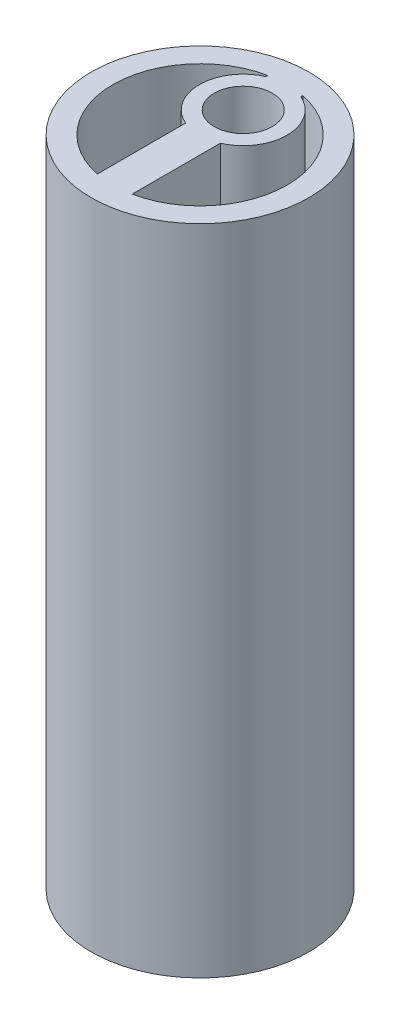
ISO-10303-21;
HEADER;
FILE_DESCRIPTION(('STEP AP214'),'2;1');
FILE_NAME('part.step','',(''),(''),'','','');
FILE_SCHEMA(('AUTOMOTIVE_DESIGN { 1 0 10303 214 1 1 1 1 }'));
ENDSEC;
DATA;
#1=APPLICATION_CONTEXT('core data for automotive mechanical design processes');
#2=APPLICATION_PROTOCOL_DEFINITION('international standard','automotive_design',2000,#1);
#3=PRODUCT_CONTEXT('',#1,'mechanical');
#4=PRODUCT('Part','Part','',(#3));
#5=PRODUCT_RELATED_PRODUCT_CATEGORY('part','',(#4));
#6=PRODUCT_DEFINITION_FORMATION('','',#4);
#7=PRODUCT_DEFINITION_CONTEXT('part definition',#1,'design');
#8=PRODUCT_DEFINITION('design','',#6,#7);
#9=PRODUCT_DEFINITION_SHAPE('','',#8);
#10=(LENGTH_UNIT() NAMED_UNIT(*) SI_UNIT(.MILLI.,.METRE.));
#11=(NAMED_UNIT(*) PLANE_ANGLE_UNIT() SI_UNIT($,.RADIAN.));
#12=(NAMED_UNIT(*) SI_UNIT($,.STERADIAN.) SOLID_ANGLE_UNIT());
#13=UNCERTAINTY_MEASURE_WITH_UNIT(LENGTH_MEASURE(1.E-05),#10,'distance_accuracy_value','');
#14=(GEOMETRIC_REPRESENTATION_CONTEXT(3) GLOBAL_UNCERTAINTY_ASSIGNED_CONTEXT((#13)) GLOBAL_UNIT_ASSIGNED_CONTEXT((#10,
#11,#12)) REPRESENTATION_CONTEXT('',''));
#15=CARTESIAN_POINT('',(0.,0.,0.));
#16=DIRECTION('',(0.,0.,1.));
#17=DIRECTION('',(1.,0.,0.));
#18=AXIS2_PLACEMENT_3D('',#15,#16,#17);
#19=CARTESIAN_POINT('',(-1.2,0.,-6.74946092621553));
#20=DIRECTION('',(-1.,0.,0.));
#21=DIRECTION('',(0.,0.,1.));
#22=AXIS2_PLACEMENT_3D('',#19,#20,#21);
#23=PLANE('',#22);
#24=DIRECTION('',(0.,1.,0.));
#25=VECTOR('',#24,1.);
#26=CARTESIAN_POINT('',(-1.2,0.,-0.203984650656139));
#27=LINE('',#26,#25);
#28=CARTESIAN_POINT('',(-1.2,0.,-0.203984650656139));
#29=VERTEX_POINT('',#28);
#30=CARTESIAN_POINT('',(-1.2,45.,-0.203984650656139));
#31=VERTEX_POINT('',#30);
#32=EDGE_CURVE('E185',#29,#31,#27,.T.);
#33=ORIENTED_EDGE('',*,*,#32,.F.);
#34=DIRECTION('',(0.,0.,1.));
#35=VECTOR('',#34,1.);
#36=CARTESIAN_POINT('',(-1.2,0.,-6.74946092621553));
#37=LINE('',#36,#35);
#38=CARTESIAN_POINT('',(-1.2,0.,5.87877538267963));
#39=VERTEX_POINT('',#38);
#40=EDGE_CURVE('E126',#29,#39,#37,.T.);
#41=ORIENTED_EDGE('',*,*,#40,.T.);
#42=DIRECTION('',(0.,-1.,0.));
#43=VECTOR('',#42,1.);
#44=CARTESIAN_POINT('',(-1.2,45.,5.87877538267963));
#45=LINE('',#44,#43);
#46=CARTESIAN_POINT('',(-1.2,45.,5.87877538267963));
#47=VERTEX_POINT('',#46);
#48=EDGE_CURVE('E160',#39,#47,#45,.F.);
#49=ORIENTED_EDGE('',*,*,#48,.T.);
#50=DIRECTION('',(0.,0.,1.));
#51=VECTOR('',#50,1.);
#52=CARTESIAN_POINT('',(-1.2,45.,-6.74946092621553));
#53=LINE('',#52,#51);
#54=EDGE_CURVE('E195',#31,#47,#53,.T.);
#55=ORIENTED_EDGE('',*,*,#54,.F.);
#56=EDGE_LOOP('',(#33,#41,#49,#55));
#57=FACE_BOUND('',#56,.T.);
#58=ADVANCED_FACE('F39',(#57),#23,.T.);
#59=CARTESIAN_POINT('',(1.2,0.,-6.74946092621553));
#60=DIRECTION('',(1.,0.,0.));
#61=DIRECTION('',(0.,0.,-1.));
#62=AXIS2_PLACEMENT_3D('',#59,#60,#61);
#63=PLANE('',#62);
#64=DIRECTION('',(0.,1.,0.));
#65=VECTOR('',#64,1.);
#66=CARTESIAN_POINT('',(1.2,0.,-5.74586140251381));
#67=LINE('',#66,#65);
#68=CARTESIAN_POINT('',(1.2,0.,-5.74586140251381));
#69=VERTEX_POINT('',#68);
#70=CARTESIAN_POINT('',(1.2,45.,-5.74586140251381));
#71=VERTEX_POINT('',#70);
#72=EDGE_CURVE('E11',#69,#71,#67,.T.);
#73=ORIENTED_EDGE('',*,*,#72,.F.);
#74=DIRECTION('',(0.,0.,-1.));
#75=VECTOR('',#74,1.);
#76=CARTESIAN_POINT('',(1.2,0.,-6.74946092621553));
#77=LINE('',#76,#75);
#78=CARTESIAN_POINT('',(1.2,0.,-5.87877538267963));
#79=VERTEX_POINT('',#78);
#80=EDGE_CURVE('E182',#69,#79,#77,.T.);
#81=ORIENTED_EDGE('',*,*,#80,.T.);
#82=DIRECTION('',(0.,-1.,0.));
#83=VECTOR('',#82,1.);
#84=CARTESIAN_POINT('',(1.2,45.,-5.87877538267963));
#85=LINE('',#84,#83);
#86=CARTESIAN_POINT('',(1.2,45.,-5.87877538267963));
#87=VERTEX_POINT('',#86);
#88=EDGE_CURVE('E150',#79,#87,#85,.F.);
#89=ORIENTED_EDGE('',*,*,#88,.T.);
#90=DIRECTION('',(0.,0.,-1.));
#91=VECTOR('',#90,1.);
#92=CARTESIAN_POINT('',(1.2,45.,-6.74946092621553));
#93=LINE('',#92,#91);
#94=EDGE_CURVE('E127',#71,#87,#93,.T.);
#95=ORIENTED_EDGE('',*,*,#94,.F.);
#96=EDGE_LOOP('',(#73,#81,#89,#95));
#97=FACE_BOUND('',#96,.T.);
#98=ADVANCED_FACE('F228',(#97),#63,.T.);
#99=CARTESIAN_POINT('',(0.,45.,0.));
#100=DIRECTION('',(0.,-1.,0.));
#101=DIRECTION('',(0.,0.,-1.));
#102=AXIS2_PLACEMENT_3D('',#99,#100,#101);
#103=CYLINDRICAL_SURFACE('',#102,6.);
#104=DIRECTION('',(0.,-1.,0.));
#105=VECTOR('',#104,1.);
#106=CARTESIAN_POINT('',(-1.2,45.,-5.87877538267963));
#107=LINE('',#106,#105);
#108=CARTESIAN_POINT('',(-1.2,45.,-5.87877538267963));
#109=VERTEX_POINT('',#108);
#110=CARTESIAN_POINT('',(-1.2,0.,-5.87877538267963));
#111=VERTEX_POINT('',#110);
#112=EDGE_CURVE('E119',#109,#111,#107,.T.);
#113=ORIENTED_EDGE('',*,*,#112,.F.);
#114=CARTESIAN_POINT('',(0.,45.,0.));
#115=DIRECTION('',(0.,1.,0.));
#116=DIRECTION('',(0.,0.,1.));
#117=AXIS2_PLACEMENT_3D('',#114,#115,#116);
#118=CIRCLE('',#117,6.);
#119=EDGE_CURVE('E140',#109,#47,#118,.T.);
#120=ORIENTED_EDGE('',*,*,#119,.T.);
#121=ORIENTED_EDGE('',*,*,#48,.F.);
#122=CARTESIAN_POINT('',(0.,0.,0.));
#123=DIRECTION('',(0.,1.,0.));
#124=DIRECTION('',(0.,0.,1.));
#125=AXIS2_PLACEMENT_3D('',#122,#123,#124);
#126=CIRCLE('',#125,6.);
#127=EDGE_CURVE('E145',#111,#39,#126,.T.);
#128=ORIENTED_EDGE('',*,*,#127,.F.);
#129=EDGE_LOOP('',(#113,#120,#121,#128));
#130=FACE_BOUND('',#129,.T.);
#131=ADVANCED_FACE('F191',(#130),#103,.F.);
#132=CARTESIAN_POINT('',(0.,45.,0.));
#133=DIRECTION('',(0.,1.,0.));
#134=DIRECTION('',(0.,0.,1.));
#135=AXIS2_PLACEMENT_3D('',#132,#133,#134);
#136=PLANE('',#135);
#137=CARTESIAN_POINT('',(0.,45.,-2.97492302658497));
#138=DIRECTION('',(0.,1.,0.));
#139=DIRECTION('',(0.,0.,1.));
#140=AXIS2_PLACEMENT_3D('',#137,#138,#139);
#141=CIRCLE('',#140,2.);
#142=CARTESIAN_POINT('',(0.,45.,-0.974923026584975));
#143=VERTEX_POINT('',#142);
#144=EDGE_CURVE('E205',#143,#143,#141,.T.);
#145=ORIENTED_EDGE('',*,*,#144,.F.);
#146=EDGE_LOOP('',(#145));
#147=FACE_BOUND('',#146,.T.);
#148=CARTESIAN_POINT('',(-1.2,45.,-5.74586140251381));
#149=VERTEX_POINT('',#148);
#150=EDGE_CURVE('E133',#109,#149,#53,.T.);
#151=ORIENTED_EDGE('',*,*,#150,.T.);
#152=CARTESIAN_POINT('',(0.,45.,-2.97492302658497));
#153=DIRECTION('',(0.,1.,0.));
#154=DIRECTION('',(0.,0.,1.));
#155=AXIS2_PLACEMENT_3D('',#152,#153,#154);
#156=CIRCLE('',#155,3.01961909571309);
#157=EDGE_CURVE('E55',#149,#31,#156,.T.);
#158=ORIENTED_EDGE('',*,*,#157,.T.);
#159=ORIENTED_EDGE('',*,*,#54,.T.);
#160=ORIENTED_EDGE('',*,*,#119,.F.);
#161=EDGE_LOOP('',(#151,#158,#159,#160));
#162=FACE_BOUND('',#161,.T.);
#163=CARTESIAN_POINT('',(1.2,45.,-0.203984650656138));
#164=VERTEX_POINT('',#163);
#165=EDGE_CURVE('E63',#164,#71,#156,.T.);
#166=ORIENTED_EDGE('',*,*,#165,.T.);
#167=ORIENTED_EDGE('',*,*,#94,.T.);
#168=CARTESIAN_POINT('',(1.2,45.,5.87877538267963));
#169=VERTEX_POINT('',#168);
#170=EDGE_CURVE('E123',#169,#87,#118,.T.);
#171=ORIENTED_EDGE('',*,*,#170,.F.);
#172=EDGE_CURVE('E115',#169,#164,#93,.T.);
#173=ORIENTED_EDGE('',*,*,#172,.T.);
#174=EDGE_LOOP('',(#166,#167,#171,#173));
#175=FACE_BOUND('',#174,.T.);
#176=CARTESIAN_POINT('',(0.,45.,0.));
#177=DIRECTION('',(0.,1.,0.));
#178=DIRECTION('',(0.,0.,1.));
#179=AXIS2_PLACEMENT_3D('',#176,#177,#178);
#180=CIRCLE('',#179,7.5);
#181=CARTESIAN_POINT('',(0.,45.,-7.5));
#182=VERTEX_POINT('',#181);
#183=EDGE_CURVE('E146',#182,#182,#180,.T.);
#184=ORIENTED_EDGE('',*,*,#183,.T.);
#185=EDGE_LOOP('',(#184));
#186=FACE_BOUND('',#185,.T.);
#187=ADVANCED_FACE('F120',(#147,#162,#175,#186),#136,.T.);
#188=CARTESIAN_POINT('',(0.,0.,0.));
#189=DIRECTION('',(0.,1.,0.));
#190=DIRECTION('',(0.,0.,1.));
#191=AXIS2_PLACEMENT_3D('',#188,#189,#190);
#192=PLANE('',#191);
#193=CARTESIAN_POINT('',(0.,0.,-2.97492302658497));
#194=DIRECTION('',(0.,1.,0.));
#195=DIRECTION('',(0.,0.,1.));
#196=AXIS2_PLACEMENT_3D('',#193,#194,#195);
#197=CIRCLE('',#196,2.);
#198=CARTESIAN_POINT('',(0.,0.,-0.974923026584975));
#199=VERTEX_POINT('',#198);
#200=EDGE_CURVE('E209',#199,#199,#197,.T.);
#201=ORIENTED_EDGE('',*,*,#200,.T.);
#202=EDGE_LOOP('',(#201));
#203=FACE_BOUND('',#202,.T.);
#204=CARTESIAN_POINT('',(0.,0.,-2.97492302658497));
#205=DIRECTION('',(0.,1.,0.));
#206=DIRECTION('',(0.,0.,1.));
#207=AXIS2_PLACEMENT_3D('',#204,#205,#206);
#208=CIRCLE('',#207,3.01961909571309);
#209=CARTESIAN_POINT('',(-1.2,0.,-5.74586140251381));
#210=VERTEX_POINT('',#209);
#211=EDGE_CURVE('E108',#210,#29,#208,.T.);
#212=ORIENTED_EDGE('',*,*,#211,.F.);
#213=EDGE_CURVE('E131',#111,#210,#37,.T.);
#214=ORIENTED_EDGE('',*,*,#213,.F.);
#215=ORIENTED_EDGE('',*,*,#127,.T.);
#216=ORIENTED_EDGE('',*,*,#40,.F.);
#217=EDGE_LOOP('',(#212,#214,#215,#216));
#218=FACE_BOUND('',#217,.T.);
#219=ORIENTED_EDGE('',*,*,#80,.F.);
#220=CARTESIAN_POINT('',(1.2,0.,-0.203984650656138));
#221=VERTEX_POINT('',#220);
#222=EDGE_CURVE('E201',#221,#69,#208,.T.);
#223=ORIENTED_EDGE('',*,*,#222,.F.);
#224=CARTESIAN_POINT('',(1.2,0.,5.87877538267963));
#225=VERTEX_POINT('',#224);
#226=EDGE_CURVE('E117',#225,#221,#77,.T.);
#227=ORIENTED_EDGE('',*,*,#226,.F.);
#228=EDGE_CURVE('E141',#225,#79,#126,.T.);
#229=ORIENTED_EDGE('',*,*,#228,.T.);
#230=EDGE_LOOP('',(#219,#223,#227,#229));
#231=FACE_BOUND('',#230,.T.);
#232=CARTESIAN_POINT('',(0.,0.,0.));
#233=DIRECTION('',(0.,1.,0.));
#234=DIRECTION('',(0.,0.,1.));
#235=AXIS2_PLACEMENT_3D('',#232,#233,#234);
#236=CIRCLE('',#235,7.5);
#237=CARTESIAN_POINT('',(0.,0.,-7.5));
#238=VERTEX_POINT('',#237);
#239=EDGE_CURVE('E139',#238,#238,#236,.T.);
#240=ORIENTED_EDGE('',*,*,#239,.F.);
#241=EDGE_LOOP('',(#240));
#242=FACE_BOUND('',#241,.T.);
#243=ADVANCED_FACE('F178',(#203,#218,#231,#242),#192,.F.);
#244=CARTESIAN_POINT('',(0.,45.,0.));
#245=DIRECTION('',(0.,-1.,0.));
#246=DIRECTION('',(0.,0.,-1.));
#247=AXIS2_PLACEMENT_3D('',#244,#245,#246);
#248=CYLINDRICAL_SURFACE('',#247,7.5);
#249=CARTESIAN_POINT('',(0.,45.,-7.5));
#250=CARTESIAN_POINT('',(0.,44.53125,-7.5));
#251=CARTESIAN_POINT('',(0.,44.0625,-7.5));
#252=CARTESIAN_POINT('',(0.,43.125,-7.5));
#253=CARTESIAN_POINT('',(0.,42.65625,-7.5));
#254=CARTESIAN_POINT('',(0.,41.71875,-7.5));
#255=CARTESIAN_POINT('',(0.,41.25,-7.5));
#256=CARTESIAN_POINT('',(0.,40.3125,-7.5));
#257=CARTESIAN_POINT('',(0.,39.84375,-7.5));
#258=CARTESIAN_POINT('',(0.,38.90625,-7.5));
#259=CARTESIAN_POINT('',(0.,38.4375,-7.5));
#260=CARTESIAN_POINT('',(0.,37.5,-7.5));
#261=CARTESIAN_POINT('',(0.,37.03125,-7.5));
#262=CARTESIAN_POINT('',(0.,36.09375,-7.5));
#263=CARTESIAN_POINT('',(0.,35.625,-7.5));
#264=CARTESIAN_POINT('',(0.,34.6875,-7.5));
#265=CARTESIAN_POINT('',(0.,34.21875,-7.5));
#266=CARTESIAN_POINT('',(0.,33.28125,-7.5));
#267=CARTESIAN_POINT('',(0.,32.8125,-7.5));
#268=CARTESIAN_POINT('',(0.,31.875,-7.5));
#269=CARTESIAN_POINT('',(0.,31.40625,-7.5));
#270=CARTESIAN_POINT('',(0.,30.46875,-7.5));
#271=CARTESIAN_POINT('',(0.,30.,-7.5));
#272=CARTESIAN_POINT('',(0.,29.0625,-7.5));
#273=CARTESIAN_POINT('',(0.,28.59375,-7.5));
#274=CARTESIAN_POINT('',(0.,27.65625,-7.5));
#275=CARTESIAN_POINT('',(0.,27.1875,-7.5));
#276=CARTESIAN_POINT('',(0.,26.25,-7.5));
#277=CARTESIAN_POINT('',(0.,25.78125,-7.5));
#278=CARTESIAN_POINT('',(0.,24.84375,-7.5));
#279=CARTESIAN_POINT('',(0.,24.375,-7.5));
#280=CARTESIAN_POINT('',(0.,23.4375,-7.5));
#281=CARTESIAN_POINT('',(0.,22.96875,-7.5));
#282=CARTESIAN_POINT('',(0.,22.03125,-7.5));
#283=CARTESIAN_POINT('',(0.,21.5625,-7.5));
#284=CARTESIAN_POINT('',(0.,20.625,-7.5));
#285=CARTESIAN_POINT('',(0.,20.15625,-7.5));
#286=CARTESIAN_POINT('',(0.,19.21875,-7.5));
#287=CARTESIAN_POINT('',(0.,18.75,-7.5));
#288=CARTESIAN_POINT('',(0.,17.8125,-7.5));
#289=CARTESIAN_POINT('',(0.,17.34375,-7.5));
#290=CARTESIAN_POINT('',(0.,16.40625,-7.5));
#291=CARTESIAN_POINT('',(0.,15.9375,-7.5));
#292=CARTESIAN_POINT('',(0.,15.,-7.5));
#293=CARTESIAN_POINT('',(0.,14.53125,-7.5));
#294=CARTESIAN_POINT('',(0.,13.59375,-7.5));
#295=CARTESIAN_POINT('',(0.,13.125,-7.5));
#296=CARTESIAN_POINT('',(0.,12.1875,-7.5));
#297=CARTESIAN_POINT('',(0.,11.71875,-7.5));
#298=CARTESIAN_POINT('',(0.,10.78125,-7.5));
#299=CARTESIAN_POINT('',(0.,10.3125,-7.5));
#300=CARTESIAN_POINT('',(0.,9.37499999999999,-7.5));
#301=CARTESIAN_POINT('',(0.,8.90624999999999,-7.5));
#302=CARTESIAN_POINT('',(0.,7.96874999999999,-7.5));
#303=CARTESIAN_POINT('',(0.,7.5,-7.5));
#304=CARTESIAN_POINT('',(0.,6.56249999999999,-7.5));
#305=CARTESIAN_POINT('',(0.,6.09374999999999,-7.5));
#306=CARTESIAN_POINT('',(0.,5.15624999999999,-7.5));
#307=CARTESIAN_POINT('',(0.,4.68749999999999,-7.5));
#308=CARTESIAN_POINT('',(0.,3.74999999999999,-7.5));
#309=CARTESIAN_POINT('',(0.,3.28124999999999,-7.5));
#310=CARTESIAN_POINT('',(0.,2.34374999999999,-7.5));
#311=CARTESIAN_POINT('',(0.,1.87499999999999,-7.5));
#312=CARTESIAN_POINT('',(0.,0.937499999999992,-7.5));
#313=CARTESIAN_POINT('',(0.,0.468749999999993,-7.5));
#314=CARTESIAN_POINT('',(0.,0.,-7.5));
#315=B_SPLINE_CURVE_WITH_KNOTS('',3,(#249,#250,#251,#252,#253,#254,#255,#256,#257,#258,#259,
#260,#261,#262,#263,#264,#265,#266,#267,#268,#269,#270,#271,#272,#273,#274,#275,#276,#277,#278,
#279,#280,#281,#282,#283,#284,#285,#286,#287,#288,#289,#290,#291,#292,#293,#294,#295,#296,#297,
#298,#299,#300,#301,#302,#303,#304,#305,#306,#307,#308,#309,#310,#311,#312,#313,#314),
.UNSPECIFIED.,.F.,.F.,(4,2,2,2,2,2,2,2,2,2,2,2,2,2,2,2,2,2,2,2,2,2,2,2,2,2,2,2,2,2,2,2,4),(0.,
1.40625,2.8125,4.21874999999999,5.625,7.03125,8.43749999999999,9.84375,11.25,12.65625,14.0625,
15.46875,16.875,18.28125,19.6875,21.09375,22.5,23.90625,25.3125,26.71875,28.125,29.53125,
30.9375,32.34375,33.75,35.15625,36.5625,37.96875,39.375,40.78125,42.1875,43.59375,45.),.UNSPECIFIED.);
#316=EDGE_CURVE('BSEAM41',#182,#238,#315,.T.);
#317=ORIENTED_EDGE('',*,*,#183,.F.);
#318=ORIENTED_EDGE('',*,*,#239,.T.);
#319=ORIENTED_EDGE('',*,*,#316,.T.);
#320=ORIENTED_EDGE('',*,*,#316,.F.);
#321=EDGE_LOOP('',(#317,#319,#318,#320));
#322=FACE_BOUND('',#321,.T.);
#323=ADVANCED_FACE('F41',(#322),#248,.T.);
#324=DIRECTION('',(0.,-1.,0.));
#325=VECTOR('',#324,1.);
#326=CARTESIAN_POINT('',(1.2,45.,5.87877538267963));
#327=LINE('',#326,#325);
#328=EDGE_CURVE('E157',#169,#225,#327,.T.);
#329=ORIENTED_EDGE('',*,*,#328,.F.);
#330=ORIENTED_EDGE('',*,*,#170,.T.);
#331=ORIENTED_EDGE('',*,*,#88,.F.);
#332=ORIENTED_EDGE('',*,*,#228,.F.);
#333=EDGE_LOOP('',(#329,#330,#331,#332));
#334=FACE_BOUND('',#333,.T.);
#335=ADVANCED_FACE('F236',(#334),#103,.F.);
#336=DIRECTION('',(0.,1.,0.));
#337=VECTOR('',#336,1.);
#338=CARTESIAN_POINT('',(-1.2,0.,-5.74586140251381));
#339=LINE('',#338,#337);
#340=EDGE_CURVE('E198',#149,#210,#339,.F.);
#341=ORIENTED_EDGE('',*,*,#340,.F.);
#342=ORIENTED_EDGE('',*,*,#150,.F.);
#343=ORIENTED_EDGE('',*,*,#112,.T.);
#344=ORIENTED_EDGE('',*,*,#213,.T.);
#345=EDGE_LOOP('',(#341,#342,#343,#344));
#346=FACE_BOUND('',#345,.T.);
#347=ADVANCED_FACE('F172',(#346),#23,.T.);
#348=DIRECTION('',(0.,1.,0.));
#349=VECTOR('',#348,1.);
#350=CARTESIAN_POINT('',(1.2,0.,-0.203984650656138));
#351=LINE('',#350,#349);
#352=EDGE_CURVE('E48',#164,#221,#351,.F.);
#353=ORIENTED_EDGE('',*,*,#352,.F.);
#354=ORIENTED_EDGE('',*,*,#172,.F.);
#355=ORIENTED_EDGE('',*,*,#328,.T.);
#356=ORIENTED_EDGE('',*,*,#226,.T.);
#357=EDGE_LOOP('',(#353,#354,#355,#356));
#358=FACE_BOUND('',#357,.T.);
#359=ADVANCED_FACE('F113',(#358),#63,.T.);
#360=CARTESIAN_POINT('',(0.,0.,-2.97492302658497));
#361=DIRECTION('',(0.,1.,0.));
#362=DIRECTION('',(0.,0.,1.));
#363=AXIS2_PLACEMENT_3D('',#360,#361,#362);
#364=CYLINDRICAL_SURFACE('',#363,3.01961909571309);
#365=ORIENTED_EDGE('',*,*,#222,.T.);
#366=ORIENTED_EDGE('',*,*,#72,.T.);
#367=ORIENTED_EDGE('',*,*,#165,.F.);
#368=ORIENTED_EDGE('',*,*,#352,.T.);
#369=EDGE_LOOP('',(#365,#366,#367,#368));
#370=FACE_BOUND('',#369,.T.);
#371=ADVANCED_FACE('F103',(#370),#364,.T.);
#372=ORIENTED_EDGE('',*,*,#211,.T.);
#373=ORIENTED_EDGE('',*,*,#32,.T.);
#374=ORIENTED_EDGE('',*,*,#157,.F.);
#375=ORIENTED_EDGE('',*,*,#340,.T.);
#376=EDGE_LOOP('',(#372,#373,#374,#375));
#377=FACE_BOUND('',#376,.T.);
#378=ADVANCED_FACE('F216',(#377),#364,.T.);
#379=CARTESIAN_POINT('',(0.,0.,-2.97492302658497));
#380=DIRECTION('',(0.,1.,0.));
#381=DIRECTION('',(0.,0.,1.));
#382=AXIS2_PLACEMENT_3D('',#379,#380,#381);
#383=CYLINDRICAL_SURFACE('',#382,2.);
#384=CARTESIAN_POINT('',(0.,0.,-0.974923026584975));
#385=CARTESIAN_POINT('',(0.,0.468749999999999,-0.974923026584975));
#386=CARTESIAN_POINT('',(0.,0.9375,-0.974923026584975));
#387=CARTESIAN_POINT('',(0.,1.875,-0.974923026584975));
#388=CARTESIAN_POINT('',(0.,2.34375,-0.974923026584975));
#389=CARTESIAN_POINT('',(0.,3.28125,-0.974923026584975));
#390=CARTESIAN_POINT('',(0.,3.75,-0.974923026584975));
#391=CARTESIAN_POINT('',(0.,4.6875,-0.974923026584975));
#392=CARTESIAN_POINT('',(0.,5.15625,-0.974923026584975));
#393=CARTESIAN_POINT('',(0.,6.09375,-0.974923026584975));
#394=CARTESIAN_POINT('',(0.,6.5625,-0.974923026584975));
#395=CARTESIAN_POINT('',(0.,7.5,-0.974923026584975));
#396=CARTESIAN_POINT('',(0.,7.96875,-0.974923026584975));
#397=CARTESIAN_POINT('',(0.,8.90625,-0.974923026584975));
#398=CARTESIAN_POINT('',(0.,9.375,-0.974923026584975));
#399=CARTESIAN_POINT('',(0.,10.3125,-0.974923026584975));
#400=CARTESIAN_POINT('',(0.,10.78125,-0.974923026584975));
#401=CARTESIAN_POINT('',(0.,11.71875,-0.974923026584975));
#402=CARTESIAN_POINT('',(0.,12.1875,-0.974923026584975));
#403=CARTESIAN_POINT('',(0.,13.125,-0.974923026584975));
#404=CARTESIAN_POINT('',(0.,13.59375,-0.974923026584975));
#405=CARTESIAN_POINT('',(0.,14.53125,-0.974923026584975));
#406=CARTESIAN_POINT('',(0.,15.,-0.974923026584975));
#407=CARTESIAN_POINT('',(0.,15.9375,-0.974923026584975));
#408=CARTESIAN_POINT('',(0.,16.40625,-0.974923026584975));
#409=CARTESIAN_POINT('',(0.,17.34375,-0.974923026584975));
#410=CARTESIAN_POINT('',(0.,17.8125,-0.974923026584975));
#411=CARTESIAN_POINT('',(0.,18.75,-0.974923026584975));
#412=CARTESIAN_POINT('',(0.,19.21875,-0.974923026584975));
#413=CARTESIAN_POINT('',(0.,20.15625,-0.974923026584975));
#414=CARTESIAN_POINT('',(0.,20.625,-0.974923026584975));
#415=CARTESIAN_POINT('',(0.,21.5625,-0.974923026584975));
#416=CARTESIAN_POINT('',(0.,22.03125,-0.974923026584975));
#417=CARTESIAN_POINT('',(0.,22.96875,-0.974923026584975));
#418=CARTESIAN_POINT('',(0.,23.4375,-0.974923026584975));
#419=CARTESIAN_POINT('',(0.,24.375,-0.974923026584975));
#420=CARTESIAN_POINT('',(0.,24.84375,-0.974923026584975));
#421=CARTESIAN_POINT('',(0.,25.78125,-0.974923026584975));
#422=CARTESIAN_POINT('',(0.,26.25,-0.974923026584975));
#423=CARTESIAN_POINT('',(0.,27.1875,-0.974923026584975));
#424=CARTESIAN_POINT('',(0.,27.65625,-0.974923026584975));
#425=CARTESIAN_POINT('',(0.,28.59375,-0.974923026584975));
#426=CARTESIAN_POINT('',(0.,29.0625,-0.974923026584975));
#427=CARTESIAN_POINT('',(0.,30.,-0.974923026584975));
#428=CARTESIAN_POINT('',(0.,30.46875,-0.974923026584975));
#429=CARTESIAN_POINT('',(0.,31.40625,-0.974923026584975));
#430=CARTESIAN_POINT('',(0.,31.875,-0.974923026584975));
#431=CARTESIAN_POINT('',(0.,32.8125,-0.974923026584975));
#432=CARTESIAN_POINT('',(0.,33.28125,-0.974923026584975));
#433=CARTESIAN_POINT('',(0.,34.21875,-0.974923026584975));
#434=CARTESIAN_POINT('',(0.,34.6875,-0.974923026584975));
#435=CARTESIAN_POINT('',(0.,35.625,-0.974923026584975));
#436=CARTESIAN_POINT('',(0.,36.09375,-0.974923026584975));
#437=CARTESIAN_POINT('',(0.,37.03125,-0.974923026584975));
#438=CARTESIAN_POINT('',(0.,37.5,-0.974923026584975));
#439=CARTESIAN_POINT('',(0.,38.4375,-0.974923026584975));
#440=CARTESIAN_POINT('',(0.,38.90625,-0.974923026584975));
#441=CARTESIAN_POINT('',(0.,39.84375,-0.974923026584975));
#442=CARTESIAN_POINT('',(0.,40.3125,-0.974923026584975));
#443=CARTESIAN_POINT('',(0.,41.25,-0.974923026584975));
#444=CARTESIAN_POINT('',(0.,41.71875,-0.974923026584975));
#445=CARTESIAN_POINT('',(0.,42.65625,-0.974923026584975));
#446=CARTESIAN_POINT('',(0.,43.125,-0.974923026584975));
#447=CARTESIAN_POINT('',(0.,44.0625,-0.974923026584975));
#448=CARTESIAN_POINT('',(0.,44.53125,-0.974923026584975));
#449=CARTESIAN_POINT('',(0.,45.,-0.974923026584975));
#450=B_SPLINE_CURVE_WITH_KNOTS('',3,(#384,#385,#386,#387,#388,#389,#390,#391,#392,#393,#394,
#395,#396,#397,#398,#399,#400,#401,#402,#403,#404,#405,#406,#407,#408,#409,#410,#411,#412,#413,
#414,#415,#416,#417,#418,#419,#420,#421,#422,#423,#424,#425,#426,#427,#428,#429,#430,#431,#432,
#433,#434,#435,#436,#437,#438,#439,#440,#441,#442,#443,#444,#445,#446,#447,#448,#449),
.UNSPECIFIED.,.F.,.F.,(4,2,2,2,2,2,2,2,2,2,2,2,2,2,2,2,2,2,2,2,2,2,2,2,2,2,2,2,2,2,2,2,4),(0.,
1.40625,2.8125,4.21875,5.625,7.03125,8.4375,9.84375,11.25,12.65625,14.0625,15.46875,16.875,
18.28125,19.6875,21.09375,22.5,23.90625,25.3125,26.71875,28.125,29.53125,30.9375,32.34375,33.75,
35.15625,36.5625,37.96875,39.375,40.78125,42.1875,43.59375,45.),.UNSPECIFIED.);
#451=EDGE_CURVE('BSEAM218',#199,#143,#450,.T.);
#452=ORIENTED_EDGE('',*,*,#200,.F.);
#453=ORIENTED_EDGE('',*,*,#144,.T.);
#454=ORIENTED_EDGE('',*,*,#451,.T.);
#455=ORIENTED_EDGE('',*,*,#451,.F.);
#456=EDGE_LOOP('',(#452,#454,#453,#455));
#457=FACE_BOUND('',#456,.T.);
#458=ADVANCED_FACE('F218',(#457),#383,.F.);
#459=CLOSED_SHELL('',(#58,#98,#131,#187,#243,#323,#335,#347,#359,#371,#378,#458));
#460=MANIFOLD_SOLID_BREP('B2',#459);
#461=ADVANCED_BREP_SHAPE_REPRESENTATION('',(#18,#460),#14);
#462=SHAPE_DEFINITION_REPRESENTATION(#9,#461);
ENDSEC;
END-ISO-10303-21;
